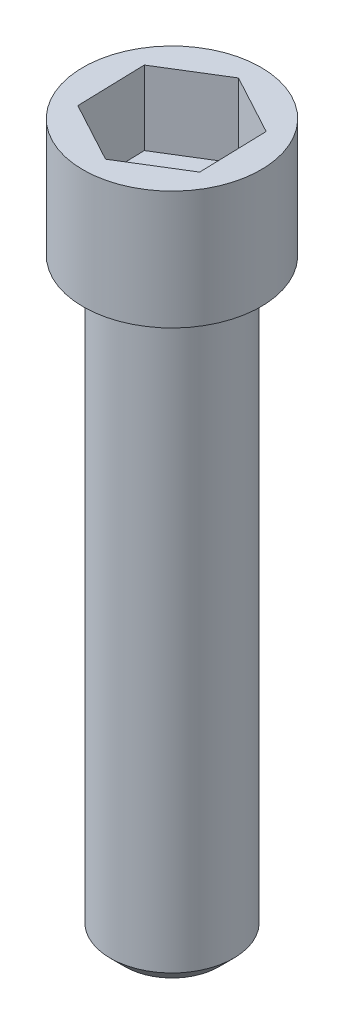
ISO-10303-21;
HEADER;
FILE_DESCRIPTION(('STEP AP214'),'2;1');
FILE_NAME('part.step','',(''),(''),'','','');
FILE_SCHEMA(('AUTOMOTIVE_DESIGN { 1 0 10303 214 1 1 1 1 }'));
ENDSEC;
DATA;
#1=APPLICATION_CONTEXT('core data for automotive mechanical design processes');
#2=APPLICATION_PROTOCOL_DEFINITION('international standard','automotive_design',2000,#1);
#3=PRODUCT_CONTEXT('',#1,'mechanical');
#4=PRODUCT('Part','Part','',(#3));
#5=PRODUCT_RELATED_PRODUCT_CATEGORY('part','',(#4));
#6=PRODUCT_DEFINITION_FORMATION('','',#4);
#7=PRODUCT_DEFINITION_CONTEXT('part definition',#1,'design');
#8=PRODUCT_DEFINITION('design','',#6,#7);
#9=PRODUCT_DEFINITION_SHAPE('','',#8);
#10=(LENGTH_UNIT() NAMED_UNIT(*) SI_UNIT(.MILLI.,.METRE.));
#11=(NAMED_UNIT(*) PLANE_ANGLE_UNIT() SI_UNIT($,.RADIAN.));
#12=(NAMED_UNIT(*) SI_UNIT($,.STERADIAN.) SOLID_ANGLE_UNIT());
#13=UNCERTAINTY_MEASURE_WITH_UNIT(LENGTH_MEASURE(1.E-05),#10,'distance_accuracy_value','');
#14=(GEOMETRIC_REPRESENTATION_CONTEXT(3) GLOBAL_UNCERTAINTY_ASSIGNED_CONTEXT((#13)) GLOBAL_UNIT_ASSIGNED_CONTEXT((#10,
#11,#12)) REPRESENTATION_CONTEXT('',''));
#15=CARTESIAN_POINT('',(0.,0.,0.));
#16=DIRECTION('',(0.,0.,1.));
#17=DIRECTION('',(1.,0.,0.));
#18=AXIS2_PLACEMENT_3D('',#15,#16,#17);
#19=CARTESIAN_POINT('',(0.,10.,0.));
#20=DIRECTION('',(0.,-1.,0.));
#21=DIRECTION('',(0.,0.,-1.));
#22=AXIS2_PLACEMENT_3D('',#19,#20,#21);
#23=CYLINDRICAL_SURFACE('',#22,1.04);
#24=CARTESIAN_POINT('',(0.,0.25,0.));
#25=DIRECTION('',(0.,1.,0.));
#26=DIRECTION('',(0.,0.,1.));
#27=AXIS2_PLACEMENT_3D('',#24,#25,#26);
#28=CIRCLE('',#27,1.04);
#29=CARTESIAN_POINT('',(0.,0.25,1.04));
#30=VERTEX_POINT('',#29);
#31=EDGE_CURVE('E40',#30,#30,#28,.T.);
#32=ORIENTED_EDGE('',*,*,#31,.T.);
#33=EDGE_LOOP('',(#32));
#34=FACE_BOUND('',#33,.T.);
#35=CARTESIAN_POINT('',(0.,10.,0.));
#36=DIRECTION('',(0.,1.,0.));
#37=DIRECTION('',(0.,0.,1.));
#38=AXIS2_PLACEMENT_3D('',#35,#36,#37);
#39=CIRCLE('',#38,1.04);
#40=CARTESIAN_POINT('',(0.,10.,1.04));
#41=VERTEX_POINT('',#40);
#42=EDGE_CURVE('E143',#41,#41,#39,.T.);
#43=ORIENTED_EDGE('',*,*,#42,.F.);
#44=EDGE_LOOP('',(#43));
#45=FACE_BOUND('',#44,.T.);
#46=ADVANCED_FACE('F32',(#34,#45),#23,.T.);
#47=CARTESIAN_POINT('',(0.,0.,0.));
#48=DIRECTION('',(0.,1.,0.));
#49=DIRECTION('',(0.,0.,1.));
#50=AXIS2_PLACEMENT_3D('',#47,#48,#49);
#51=PLANE('',#50);
#52=CARTESIAN_POINT('',(0.,0.,0.));
#53=DIRECTION('',(0.,1.,0.));
#54=DIRECTION('',(0.,0.,1.));
#55=AXIS2_PLACEMENT_3D('',#52,#53,#54);
#56=CIRCLE('',#55,0.789999999999997);
#57=CARTESIAN_POINT('',(0.,0.,0.789999999999997));
#58=VERTEX_POINT('',#57);
#59=EDGE_CURVE('E11',#58,#58,#56,.F.);
#60=ORIENTED_EDGE('',*,*,#59,.T.);
#61=EDGE_LOOP('',(#60));
#62=FACE_BOUND('',#61,.T.);
#63=ADVANCED_FACE('F161',(#62),#51,.F.);
#64=CARTESIAN_POINT('',(0.,12.,0.));
#65=DIRECTION('',(0.,-1.,0.));
#66=DIRECTION('',(0.,0.,-1.));
#67=AXIS2_PLACEMENT_3D('',#64,#65,#66);
#68=CYLINDRICAL_SURFACE('',#67,1.5);
#69=CARTESIAN_POINT('',(0.,12.,0.));
#70=DIRECTION('',(0.,1.,0.));
#71=DIRECTION('',(0.,0.,1.));
#72=AXIS2_PLACEMENT_3D('',#69,#70,#71);
#73=CIRCLE('',#72,1.5);
#74=CARTESIAN_POINT('',(0.,12.,1.5));
#75=VERTEX_POINT('',#74);
#76=EDGE_CURVE('E140',#75,#75,#73,.T.);
#77=ORIENTED_EDGE('',*,*,#76,.F.);
#78=EDGE_LOOP('',(#77));
#79=FACE_BOUND('',#78,.T.);
#80=CARTESIAN_POINT('',(0.,10.,0.));
#81=DIRECTION('',(0.,1.,0.));
#82=DIRECTION('',(0.,0.,1.));
#83=AXIS2_PLACEMENT_3D('',#80,#81,#82);
#84=CIRCLE('',#83,1.5);
#85=CARTESIAN_POINT('',(0.,10.,1.5));
#86=VERTEX_POINT('',#85);
#87=EDGE_CURVE('E134',#86,#86,#84,.T.);
#88=ORIENTED_EDGE('',*,*,#87,.T.);
#89=EDGE_LOOP('',(#88));
#90=FACE_BOUND('',#89,.T.);
#91=ADVANCED_FACE('F165',(#79,#90),#68,.T.);
#92=CARTESIAN_POINT('',(0.,12.,0.));
#93=DIRECTION('',(0.,1.,0.));
#94=DIRECTION('',(0.,0.,1.));
#95=AXIS2_PLACEMENT_3D('',#92,#93,#94);
#96=PLANE('',#95);
#97=DIRECTION('',(-0.879869485296028,0.,-0.475215413096947));
#98=VECTOR('',#97,1.);
#99=CARTESIAN_POINT('',(0.983208297284347,12.,-0.605503738621446));
#100=LINE('',#99,#98);
#101=CARTESIAN_POINT('',(0.983208297284347,12.,-0.605503738621446));
#102=VERTEX_POINT('',#101);
#103=CARTESIAN_POINT('',(-0.0327774710904521,12.,-1.15423523197061));
#104=VERTEX_POINT('',#103);
#105=EDGE_CURVE('E47',#102,#104,#100,.T.);
#106=ORIENTED_EDGE('',*,*,#105,.F.);
#107=DIRECTION('',(-0.0283861226361414,0.,-0.999597032829573));
#108=VECTOR('',#107,1.);
#109=CARTESIAN_POINT('',(1.0159857683748,12.,0.548731493349163));
#110=LINE('',#109,#108);
#111=CARTESIAN_POINT('',(1.0159857683748,12.,0.548731493349163));
#112=VERTEX_POINT('',#111);
#113=EDGE_CURVE('E130',#112,#102,#110,.T.);
#114=ORIENTED_EDGE('',*,*,#113,.F.);
#115=DIRECTION('',(0.851483362659887,0.,-0.524381619732625));
#116=VECTOR('',#115,1.);
#117=CARTESIAN_POINT('',(0.0327774710904519,12.,1.15423523197061));
#118=LINE('',#117,#116);
#119=CARTESIAN_POINT('',(0.0327774710904519,12.,1.15423523197061));
#120=VERTEX_POINT('',#119);
#121=EDGE_CURVE('E128',#120,#112,#118,.T.);
#122=ORIENTED_EDGE('',*,*,#121,.F.);
#123=DIRECTION('',(0.879869485296028,0.,0.475215413096947));
#124=VECTOR('',#123,1.);
#125=CARTESIAN_POINT('',(-0.983208297284346,12.,0.605503738621447));
#126=LINE('',#125,#124);
#127=CARTESIAN_POINT('',(-0.983208297284346,12.,0.605503738621447));
#128=VERTEX_POINT('',#127);
#129=EDGE_CURVE('E95',#128,#120,#126,.T.);
#130=ORIENTED_EDGE('',*,*,#129,.F.);
#131=DIRECTION('',(0.0283861226361416,0.,0.999597032829573));
#132=VECTOR('',#131,1.);
#133=CARTESIAN_POINT('',(-1.0159857683748,12.,-0.548731493349163));
#134=LINE('',#133,#132);
#135=CARTESIAN_POINT('',(-1.0159857683748,12.,-0.548731493349163));
#136=VERTEX_POINT('',#135);
#137=EDGE_CURVE('E124',#136,#128,#134,.T.);
#138=ORIENTED_EDGE('',*,*,#137,.F.);
#139=DIRECTION('',(-0.851483362659887,0.,0.524381619732626));
#140=VECTOR('',#139,1.);
#141=CARTESIAN_POINT('',(-0.0327774710904521,12.,-1.15423523197061));
#142=LINE('',#141,#140);
#143=EDGE_CURVE('E121',#104,#136,#142,.T.);
#144=ORIENTED_EDGE('',*,*,#143,.F.);
#145=EDGE_LOOP('',(#106,#114,#122,#130,#138,#144));
#146=FACE_BOUND('',#145,.T.);
#147=ORIENTED_EDGE('',*,*,#76,.T.);
#148=EDGE_LOOP('',(#147));
#149=FACE_BOUND('',#148,.T.);
#150=ADVANCED_FACE('F171',(#146,#149),#96,.T.);
#151=CARTESIAN_POINT('',(0.,10.,0.));
#152=DIRECTION('',(0.,1.,0.));
#153=DIRECTION('',(0.,0.,1.));
#154=AXIS2_PLACEMENT_3D('',#151,#152,#153);
#155=PLANE('',#154);
#156=ORIENTED_EDGE('',*,*,#42,.T.);
#157=EDGE_LOOP('',(#156));
#158=FACE_BOUND('',#157,.T.);
#159=ORIENTED_EDGE('',*,*,#87,.F.);
#160=EDGE_LOOP('',(#159));
#161=FACE_BOUND('',#160,.T.);
#162=ADVANCED_FACE('F173',(#158,#161),#155,.F.);
#163=CARTESIAN_POINT('',(0.983208297284347,10.75,-0.605503738621446));
#164=DIRECTION('',(0.475215413096947,0.,-0.879869485296028));
#165=DIRECTION('',(-0.879869485296028,0.,-0.475215413096947));
#166=AXIS2_PLACEMENT_3D('',#163,#164,#165);
#167=PLANE('',#166);
#168=ORIENTED_EDGE('',*,*,#105,.T.);
#169=DIRECTION('',(0.,1.,0.));
#170=VECTOR('',#169,1.);
#171=CARTESIAN_POINT('',(-0.0327774710904521,10.75,-1.15423523197061));
#172=LINE('',#171,#170);
#173=CARTESIAN_POINT('',(-0.0327774710904521,10.75,-1.15423523197061));
#174=VERTEX_POINT('',#173);
#175=EDGE_CURVE('E77',#174,#104,#172,.T.);
#176=ORIENTED_EDGE('',*,*,#175,.F.);
#177=DIRECTION('',(-0.879869485296028,0.,-0.475215413096947));
#178=VECTOR('',#177,1.);
#179=CARTESIAN_POINT('',(0.983208297284347,10.75,-0.605503738621446));
#180=LINE('',#179,#178);
#181=CARTESIAN_POINT('',(0.983208297284347,10.75,-0.605503738621446));
#182=VERTEX_POINT('',#181);
#183=EDGE_CURVE('E132',#182,#174,#180,.T.);
#184=ORIENTED_EDGE('',*,*,#183,.F.);
#185=DIRECTION('',(0.,1.,0.));
#186=VECTOR('',#185,1.);
#187=CARTESIAN_POINT('',(0.983208297284347,10.75,-0.605503738621446));
#188=LINE('',#187,#186);
#189=EDGE_CURVE('E55',#182,#102,#188,.T.);
#190=ORIENTED_EDGE('',*,*,#189,.T.);
#191=EDGE_LOOP('',(#168,#176,#184,#190));
#192=FACE_BOUND('',#191,.T.);
#193=ADVANCED_FACE('F176',(#192),#167,.F.);
#194=CARTESIAN_POINT('',(1.0159857683748,10.75,0.548731493349163));
#195=DIRECTION('',(0.999597032829573,0.,-0.0283861226361414));
#196=DIRECTION('',(-0.0283861226361414,0.,-0.999597032829573));
#197=AXIS2_PLACEMENT_3D('',#194,#195,#196);
#198=PLANE('',#197);
#199=ORIENTED_EDGE('',*,*,#113,.T.);
#200=ORIENTED_EDGE('',*,*,#189,.F.);
#201=DIRECTION('',(-0.0283861226361414,0.,-0.999597032829573));
#202=VECTOR('',#201,1.);
#203=CARTESIAN_POINT('',(1.0159857683748,10.75,0.548731493349163));
#204=LINE('',#203,#202);
#205=CARTESIAN_POINT('',(1.0159857683748,10.75,0.548731493349163));
#206=VERTEX_POINT('',#205);
#207=EDGE_CURVE('E107',#206,#182,#204,.T.);
#208=ORIENTED_EDGE('',*,*,#207,.F.);
#209=DIRECTION('',(0.,1.,0.));
#210=VECTOR('',#209,1.);
#211=CARTESIAN_POINT('',(1.0159857683748,10.75,0.548731493349163));
#212=LINE('',#211,#210);
#213=EDGE_CURVE('E99',#206,#112,#212,.T.);
#214=ORIENTED_EDGE('',*,*,#213,.T.);
#215=EDGE_LOOP('',(#199,#200,#208,#214));
#216=FACE_BOUND('',#215,.T.);
#217=ADVANCED_FACE('F183',(#216),#198,.F.);
#218=CARTESIAN_POINT('',(0.0327774710904519,10.75,1.15423523197061));
#219=DIRECTION('',(0.524381619732625,0.,0.851483362659887));
#220=DIRECTION('',(0.851483362659887,0.,-0.524381619732625));
#221=AXIS2_PLACEMENT_3D('',#218,#219,#220);
#222=PLANE('',#221);
#223=ORIENTED_EDGE('',*,*,#121,.T.);
#224=ORIENTED_EDGE('',*,*,#213,.F.);
#225=DIRECTION('',(0.851483362659887,0.,-0.524381619732625));
#226=VECTOR('',#225,1.);
#227=CARTESIAN_POINT('',(0.0327774710904519,10.75,1.15423523197061));
#228=LINE('',#227,#226);
#229=CARTESIAN_POINT('',(0.0327774710904519,10.75,1.15423523197061));
#230=VERTEX_POINT('',#229);
#231=EDGE_CURVE('E103',#230,#206,#228,.T.);
#232=ORIENTED_EDGE('',*,*,#231,.F.);
#233=DIRECTION('',(0.,1.,0.));
#234=VECTOR('',#233,1.);
#235=CARTESIAN_POINT('',(0.0327774710904519,10.75,1.15423523197061));
#236=LINE('',#235,#234);
#237=EDGE_CURVE('E88',#230,#120,#236,.T.);
#238=ORIENTED_EDGE('',*,*,#237,.T.);
#239=EDGE_LOOP('',(#223,#224,#232,#238));
#240=FACE_BOUND('',#239,.T.);
#241=ADVANCED_FACE('F104',(#240),#222,.F.);
#242=CARTESIAN_POINT('',(-0.983208297284346,10.75,0.605503738621447));
#243=DIRECTION('',(-0.475215413096947,0.,0.879869485296028));
#244=DIRECTION('',(0.879869485296028,0.,0.475215413096947));
#245=AXIS2_PLACEMENT_3D('',#242,#243,#244);
#246=PLANE('',#245);
#247=ORIENTED_EDGE('',*,*,#129,.T.);
#248=ORIENTED_EDGE('',*,*,#237,.F.);
#249=DIRECTION('',(0.879869485296028,0.,0.475215413096947));
#250=VECTOR('',#249,1.);
#251=CARTESIAN_POINT('',(-0.983208297284346,10.75,0.605503738621447));
#252=LINE('',#251,#250);
#253=CARTESIAN_POINT('',(-0.983208297284346,10.75,0.605503738621447));
#254=VERTEX_POINT('',#253);
#255=EDGE_CURVE('E92',#254,#230,#252,.T.);
#256=ORIENTED_EDGE('',*,*,#255,.F.);
#257=DIRECTION('',(0.,1.,0.));
#258=VECTOR('',#257,1.);
#259=CARTESIAN_POINT('',(-0.983208297284346,10.75,0.605503738621447));
#260=LINE('',#259,#258);
#261=EDGE_CURVE('E100',#254,#128,#260,.T.);
#262=ORIENTED_EDGE('',*,*,#261,.T.);
#263=EDGE_LOOP('',(#247,#248,#256,#262));
#264=FACE_BOUND('',#263,.T.);
#265=ADVANCED_FACE('F90',(#264),#246,.F.);
#266=CARTESIAN_POINT('',(-1.0159857683748,10.75,-0.548731493349163));
#267=DIRECTION('',(-0.999597032829573,0.,0.0283861226361416));
#268=DIRECTION('',(0.0283861226361416,0.,0.999597032829573));
#269=AXIS2_PLACEMENT_3D('',#266,#267,#268);
#270=PLANE('',#269);
#271=ORIENTED_EDGE('',*,*,#137,.T.);
#272=ORIENTED_EDGE('',*,*,#261,.F.);
#273=DIRECTION('',(0.0283861226361416,0.,0.999597032829573));
#274=VECTOR('',#273,1.);
#275=CARTESIAN_POINT('',(-1.0159857683748,10.75,-0.548731493349163));
#276=LINE('',#275,#274);
#277=CARTESIAN_POINT('',(-1.0159857683748,10.75,-0.548731493349163));
#278=VERTEX_POINT('',#277);
#279=EDGE_CURVE('E113',#278,#254,#276,.T.);
#280=ORIENTED_EDGE('',*,*,#279,.F.);
#281=DIRECTION('',(0.,1.,0.));
#282=VECTOR('',#281,1.);
#283=CARTESIAN_POINT('',(-1.0159857683748,10.75,-0.548731493349163));
#284=LINE('',#283,#282);
#285=EDGE_CURVE('E137',#278,#136,#284,.T.);
#286=ORIENTED_EDGE('',*,*,#285,.T.);
#287=EDGE_LOOP('',(#271,#272,#280,#286));
#288=FACE_BOUND('',#287,.T.);
#289=ADVANCED_FACE('F186',(#288),#270,.F.);
#290=CARTESIAN_POINT('',(-0.0327774710904521,10.75,-1.15423523197061));
#291=DIRECTION('',(-0.524381619732626,0.,-0.851483362659887));
#292=DIRECTION('',(-0.851483362659887,0.,0.524381619732626));
#293=AXIS2_PLACEMENT_3D('',#290,#291,#292);
#294=PLANE('',#293);
#295=ORIENTED_EDGE('',*,*,#143,.T.);
#296=ORIENTED_EDGE('',*,*,#285,.F.);
#297=DIRECTION('',(-0.851483362659887,0.,0.524381619732626));
#298=VECTOR('',#297,1.);
#299=CARTESIAN_POINT('',(-0.0327774710904521,10.75,-1.15423523197061));
#300=LINE('',#299,#298);
#301=EDGE_CURVE('E115',#174,#278,#300,.T.);
#302=ORIENTED_EDGE('',*,*,#301,.F.);
#303=ORIENTED_EDGE('',*,*,#175,.T.);
#304=EDGE_LOOP('',(#295,#296,#302,#303));
#305=FACE_BOUND('',#304,.T.);
#306=ADVANCED_FACE('F157',(#305),#294,.F.);
#307=CARTESIAN_POINT('',(0.,10.75,0.));
#308=DIRECTION('',(0.,1.,0.));
#309=DIRECTION('',(0.,0.,1.));
#310=AXIS2_PLACEMENT_3D('',#307,#308,#309);
#311=PLANE('',#310);
#312=ORIENTED_EDGE('',*,*,#183,.T.);
#313=ORIENTED_EDGE('',*,*,#301,.T.);
#314=ORIENTED_EDGE('',*,*,#279,.T.);
#315=ORIENTED_EDGE('',*,*,#255,.T.);
#316=ORIENTED_EDGE('',*,*,#231,.T.);
#317=ORIENTED_EDGE('',*,*,#207,.T.);
#318=EDGE_LOOP('',(#312,#313,#314,#315,#316,#317));
#319=FACE_BOUND('',#318,.T.);
#320=ADVANCED_FACE('F110',(#319),#311,.T.);
#321=CARTESIAN_POINT('',(0.,0.25,0.));
#322=DIRECTION('',(0.,1.,0.));
#323=DIRECTION('',(0.,0.,1.));
#324=AXIS2_PLACEMENT_3D('',#321,#322,#323);
#325=CONICAL_SURFACE('',#324,1.04,0.785398163397453);
#326=ORIENTED_EDGE('',*,*,#59,.F.);
#327=EDGE_LOOP('',(#326));
#328=FACE_BOUND('',#327,.T.);
#329=ORIENTED_EDGE('',*,*,#31,.F.);
#330=EDGE_LOOP('',(#329));
#331=FACE_BOUND('',#330,.T.);
#332=ADVANCED_FACE('F34',(#328,#331),#325,.T.);
#333=CLOSED_SHELL('',(#46,#63,#91,#150,#162,#193,#217,#241,#265,#289,#306,#320,#332));
#334=MANIFOLD_SOLID_BREP('B2',#333);
#335=ADVANCED_BREP_SHAPE_REPRESENTATION('',(#18,#334),#14);
#336=SHAPE_DEFINITION_REPRESENTATION(#9,#335);
ENDSEC;
END-ISO-10303-21;
